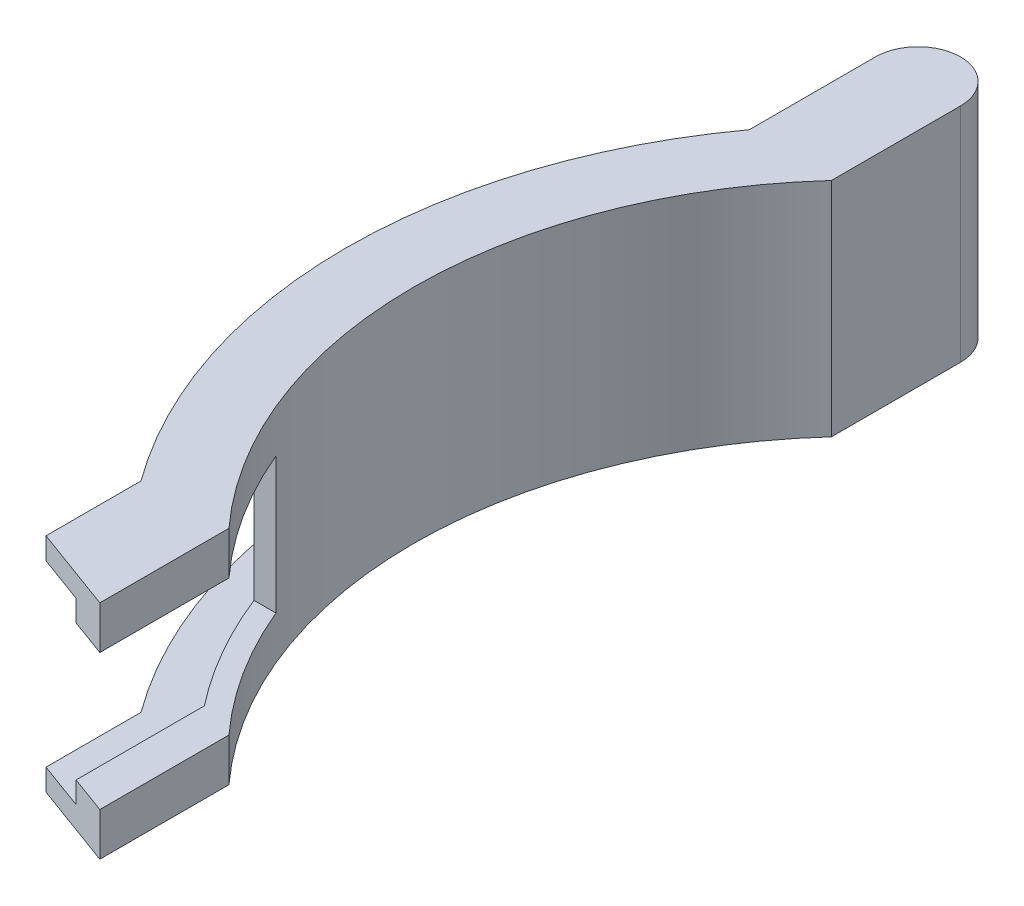
ISO-10303-21;
HEADER;
FILE_DESCRIPTION(('STEP AP214'),'2;1');
FILE_NAME('part.step','',(''),(''),'','','');
FILE_SCHEMA(('AUTOMOTIVE_DESIGN { 1 0 10303 214 1 1 1 1 }'));
ENDSEC;
DATA;
#1=APPLICATION_CONTEXT('core data for automotive mechanical design processes');
#2=APPLICATION_PROTOCOL_DEFINITION('international standard','automotive_design',2000,#1);
#3=PRODUCT_CONTEXT('',#1,'mechanical');
#4=PRODUCT('Part','Part','',(#3));
#5=PRODUCT_RELATED_PRODUCT_CATEGORY('part','',(#4));
#6=PRODUCT_DEFINITION_FORMATION('','',#4);
#7=PRODUCT_DEFINITION_CONTEXT('part definition',#1,'design');
#8=PRODUCT_DEFINITION('design','',#6,#7);
#9=PRODUCT_DEFINITION_SHAPE('','',#8);
#10=(LENGTH_UNIT() NAMED_UNIT(*) SI_UNIT(.MILLI.,.METRE.));
#11=(NAMED_UNIT(*) PLANE_ANGLE_UNIT() SI_UNIT($,.RADIAN.));
#12=(NAMED_UNIT(*) SI_UNIT($,.STERADIAN.) SOLID_ANGLE_UNIT());
#13=UNCERTAINTY_MEASURE_WITH_UNIT(LENGTH_MEASURE(1.E-05),#10,'distance_accuracy_value','');
#14=(GEOMETRIC_REPRESENTATION_CONTEXT(3) GLOBAL_UNCERTAINTY_ASSIGNED_CONTEXT((#13)) GLOBAL_UNIT_ASSIGNED_CONTEXT((#10,
#11,#12)) REPRESENTATION_CONTEXT('',''));
#15=CARTESIAN_POINT('',(0.,0.,0.));
#16=DIRECTION('',(0.,0.,1.));
#17=DIRECTION('',(1.,0.,0.));
#18=AXIS2_PLACEMENT_3D('',#15,#16,#17);
#19=CARTESIAN_POINT('',(45.070883340399,13.208,-19.0499999999988));
#20=DIRECTION('',(0.,1.,0.));
#21=DIRECTION('',(0.,0.,1.));
#22=AXIS2_PLACEMENT_3D('',#19,#20,#21);
#23=PLANE('',#22);
#24=DIRECTION('',(-1.,0.,0.));
#25=VECTOR('',#24,1.);
#26=CARTESIAN_POINT('',(12.971967470857,13.208,-6.35));
#27=LINE('',#26,#25);
#28=CARTESIAN_POINT('',(14.5908833403985,13.208,-6.35));
#29=VERTEX_POINT('',#28);
#30=CARTESIAN_POINT('',(12.971967470857,13.208,-6.35));
#31=VERTEX_POINT('',#30);
#32=EDGE_CURVE('E55',#29,#31,#27,.T.);
#33=ORIENTED_EDGE('',*,*,#32,.F.);
#34=CARTESIAN_POINT('',(45.070883340399,13.208,-19.0499999999988));
#35=DIRECTION('',(0.,1.,0.));
#36=DIRECTION('',(0.,0.,1.));
#37=AXIS2_PLACEMENT_3D('',#34,#35,#36);
#38=CIRCLE('',#37,33.02);
#39=CARTESIAN_POINT('',(20.650199999999,13.208,3.1750000042287));
#40=VERTEX_POINT('',#39);
#41=EDGE_CURVE('E111',#29,#40,#38,.T.);
#42=ORIENTED_EDGE('',*,*,#41,.T.);
#43=DIRECTION('',(0.,0.,1.));
#44=VECTOR('',#43,1.);
#45=CARTESIAN_POINT('',(20.650199999999,13.208,3.1750000042287));
#46=LINE('',#45,#44);
#47=CARTESIAN_POINT('',(20.650199999999,13.208,12.6999999966649));
#48=VERTEX_POINT('',#47);
#49=EDGE_CURVE('E107',#40,#48,#46,.T.);
#50=ORIENTED_EDGE('',*,*,#49,.T.);
#51=DIRECTION('',(-0.93894337416413,0.,-0.344071707807078));
#52=VECTOR('',#51,1.);
#53=CARTESIAN_POINT('',(20.650199999999,13.208,12.6999999966649));
#54=LINE('',#53,#52);
#55=CARTESIAN_POINT('',(17.8802000055981,13.208,11.68494556961));
#56=VERTEX_POINT('',#55);
#57=EDGE_CURVE('E87',#48,#56,#54,.T.);
#58=ORIENTED_EDGE('',*,*,#57,.T.);
#59=DIRECTION('',(0.,0.,-1.));
#60=VECTOR('',#59,1.);
#61=CARTESIAN_POINT('',(17.8802000055981,13.208,11.68494556961));
#62=LINE('',#61,#60);
#63=CARTESIAN_POINT('',(17.8802000055981,13.208,2.21727861731799));
#64=VERTEX_POINT('',#63);
#65=EDGE_CURVE('E100',#56,#64,#62,.T.);
#66=ORIENTED_EDGE('',*,*,#65,.T.);
#67=CARTESIAN_POINT('',(45.070883340399,13.208,-19.0499999999988));
#68=DIRECTION('',(0.,-1.,0.));
#69=DIRECTION('',(0.,0.,-1.));
#70=AXIS2_PLACEMENT_3D('',#67,#68,#69);
#71=CIRCLE('',#70,34.52);
#72=EDGE_CURVE('E104',#64,#31,#71,.T.);
#73=ORIENTED_EDGE('',*,*,#72,.T.);
#74=EDGE_LOOP('',(#33,#42,#50,#58,#66,#73));
#75=FACE_BOUND('',#74,.T.);
#76=ADVANCED_FACE('F39',(#75),#23,.F.);
#77=CARTESIAN_POINT('',(45.070883340399,14.783,-19.0499999999988));
#78=DIRECTION('',(0.,-1.,0.));
#79=DIRECTION('',(0.,0.,-1.));
#80=AXIS2_PLACEMENT_3D('',#77,#78,#79);
#81=CYLINDRICAL_SURFACE('',#80,33.02);
#82=ORIENTED_EDGE('',*,*,#41,.F.);
#83=DIRECTION('',(0.,1.,0.));
#84=VECTOR('',#83,1.);
#85=CARTESIAN_POINT('',(14.5908833399927,3.175,-6.35));
#86=LINE('',#85,#84);
#87=CARTESIAN_POINT('',(14.5908833399927,3.175,-6.35));
#88=VERTEX_POINT('',#87);
#89=EDGE_CURVE('E359',#88,#29,#86,.T.);
#90=ORIENTED_EDGE('',*,*,#89,.F.);
#91=CARTESIAN_POINT('',(45.0708833404013,3.175,-19.0499999999992));
#92=DIRECTION('',(0.,1.,0.));
#93=DIRECTION('',(0.,0.,-1.));
#94=AXIS2_PLACEMENT_3D('',#91,#92,#93);
#95=CIRCLE('',#94,33.02);
#96=CARTESIAN_POINT('',(20.6502000000013,3.175,3.17500000422821));
#97=VERTEX_POINT('',#96);
#98=EDGE_CURVE('E305',#88,#97,#95,.T.);
#99=ORIENTED_EDGE('',*,*,#98,.T.);
#100=DIRECTION('',(0.,1.,0.));
#101=VECTOR('',#100,1.);
#102=CARTESIAN_POINT('',(20.6502000000013,1.6,3.17500000422821));
#103=LINE('',#102,#101);
#104=CARTESIAN_POINT('',(20.6502,0.,3.17500000422744));
#105=VERTEX_POINT('',#104);
#106=EDGE_CURVE('E345',#105,#97,#103,.T.);
#107=ORIENTED_EDGE('',*,*,#106,.F.);
#108=CARTESIAN_POINT('',(45.0708833404,0.,-19.05));
#109=DIRECTION('',(0.,1.,0.));
#110=DIRECTION('',(0.,0.,-1.));
#111=AXIS2_PLACEMENT_3D('',#108,#109,#110);
#112=CIRCLE('',#111,33.02);
#113=CARTESIAN_POINT('',(20.6502,0.,-41.2750000042275));
#114=VERTEX_POINT('',#113);
#115=EDGE_CURVE('E669',#114,#105,#112,.T.);
#116=ORIENTED_EDGE('',*,*,#115,.F.);
#117=DIRECTION('',(0.,-1.,0.));
#118=VECTOR('',#117,1.);
#119=CARTESIAN_POINT('',(20.650199999999,14.783,-41.2750000042262));
#120=LINE('',#119,#118);
#121=CARTESIAN_POINT('',(20.6502,16.383,-41.2750000042275));
#122=VERTEX_POINT('',#121);
#123=EDGE_CURVE('E48',#122,#114,#120,.T.);
#124=ORIENTED_EDGE('',*,*,#123,.F.);
#125=CARTESIAN_POINT('',(45.0708833404,16.383,-19.05));
#126=DIRECTION('',(0.,-1.,0.));
#127=DIRECTION('',(0.,0.,1.));
#128=AXIS2_PLACEMENT_3D('',#125,#126,#127);
#129=CIRCLE('',#128,33.02);
#130=CARTESIAN_POINT('',(20.6502,16.383,3.17500000422744));
#131=VERTEX_POINT('',#130);
#132=EDGE_CURVE('E284',#131,#122,#129,.T.);
#133=ORIENTED_EDGE('',*,*,#132,.F.);
#134=DIRECTION('',(0.,-1.,0.));
#135=VECTOR('',#134,1.);
#136=CARTESIAN_POINT('',(20.650199999999,14.783,3.1750000042287));
#137=LINE('',#136,#135);
#138=EDGE_CURVE('E128',#131,#40,#137,.T.);
#139=ORIENTED_EDGE('',*,*,#138,.T.);
#140=EDGE_LOOP('',(#82,#90,#99,#107,#116,#124,#133,#139));
#141=FACE_BOUND('',#140,.T.);
#142=ADVANCED_FACE('F41',(#141),#81,.F.);
#143=CARTESIAN_POINT('',(20.650199999999,14.783,-41.4910863472114));
#144=DIRECTION('',(1.,0.,0.));
#145=DIRECTION('',(0.,0.,-1.));
#146=AXIS2_PLACEMENT_3D('',#143,#144,#145);
#147=PLANE('',#146);
#148=ORIENTED_EDGE('',*,*,#123,.T.);
#149=DIRECTION('',(0.,0.,1.));
#150=VECTOR('',#149,1.);
#151=CARTESIAN_POINT('',(20.6502,0.,-41.2750000042275));
#152=LINE('',#151,#150);
#153=CARTESIAN_POINT('',(20.6502,0.,-50.8));
#154=VERTEX_POINT('',#153);
#155=EDGE_CURVE('E291',#154,#114,#152,.T.);
#156=ORIENTED_EDGE('',*,*,#155,.F.);
#157=DIRECTION('',(0.,-1.,0.));
#158=VECTOR('',#157,1.);
#159=CARTESIAN_POINT('',(20.6502,1.6,-50.8));
#160=LINE('',#159,#158);
#161=CARTESIAN_POINT('',(20.6502,16.383,-50.8));
#162=VERTEX_POINT('',#161);
#163=EDGE_CURVE('E270',#162,#154,#160,.T.);
#164=ORIENTED_EDGE('',*,*,#163,.F.);
#165=DIRECTION('',(0.,0.,-1.));
#166=VECTOR('',#165,1.);
#167=CARTESIAN_POINT('',(20.6502,16.383,-41.4910863472114));
#168=LINE('',#167,#166);
#169=EDGE_CURVE('E281',#122,#162,#168,.T.);
#170=ORIENTED_EDGE('',*,*,#169,.F.);
#171=EDGE_LOOP('',(#148,#156,#164,#170));
#172=FACE_BOUND('',#171,.T.);
#173=ADVANCED_FACE('F289',(#172),#147,.T.);
#174=CARTESIAN_POINT('',(17.8802000055981,14.783,-40.3172786173155));
#175=DIRECTION('',(-1.,0.,0.));
#176=DIRECTION('',(0.,0.,1.));
#177=AXIS2_PLACEMENT_3D('',#174,#175,#176);
#178=PLANE('',#177);
#179=DIRECTION('',(0.,1.,0.));
#180=VECTOR('',#179,1.);
#181=CARTESIAN_POINT('',(17.8802000055981,-8.86711902815972,-47.6863205077591));
#182=LINE('',#181,#180);
#183=CARTESIAN_POINT('',(17.8802000056,1.6,-47.6863205077593));
#184=VERTEX_POINT('',#183);
#185=CARTESIAN_POINT('',(17.8802000055981,14.783,-47.6863205077591));
#186=VERTEX_POINT('',#185);
#187=EDGE_CURVE('E632',#184,#186,#182,.T.);
#188=ORIENTED_EDGE('',*,*,#187,.F.);
#189=DIRECTION('',(0.,0.,-1.));
#190=VECTOR('',#189,1.);
#191=CARTESIAN_POINT('',(17.8802000056,1.6,-41.4910863472114));
#192=LINE('',#191,#190);
#193=CARTESIAN_POINT('',(17.8802000056,1.6,-40.3172786173155));
#194=VERTEX_POINT('',#193);
#195=EDGE_CURVE('E315',#194,#184,#192,.T.);
#196=ORIENTED_EDGE('',*,*,#195,.F.);
#197=DIRECTION('',(0.,-1.,0.));
#198=VECTOR('',#197,1.);
#199=CARTESIAN_POINT('',(17.8802000055981,14.783,-40.3172786173155));
#200=LINE('',#199,#198);
#201=CARTESIAN_POINT('',(17.8802000055981,14.783,-40.3172786173155));
#202=VERTEX_POINT('',#201);
#203=EDGE_CURVE('E121',#202,#194,#200,.T.);
#204=ORIENTED_EDGE('',*,*,#203,.F.);
#205=DIRECTION('',(0.,0.,-1.));
#206=VECTOR('',#205,1.);
#207=CARTESIAN_POINT('',(17.8802000055981,14.783,-40.3172786173155));
#208=LINE('',#207,#206);
#209=EDGE_CURVE('E131',#202,#186,#208,.T.);
#210=ORIENTED_EDGE('',*,*,#209,.T.);
#211=EDGE_LOOP('',(#188,#196,#204,#210));
#212=FACE_BOUND('',#211,.T.);
#213=ADVANCED_FACE('F418',(#212),#178,.T.);
#214=CARTESIAN_POINT('',(45.070883340399,14.783,-19.0499999999988));
#215=DIRECTION('',(0.,-1.,0.));
#216=DIRECTION('',(0.,0.,-1.));
#217=AXIS2_PLACEMENT_3D('',#214,#215,#216);
#218=CYLINDRICAL_SURFACE('',#217,34.52);
#219=ORIENTED_EDGE('',*,*,#72,.F.);
#220=DIRECTION('',(0.,-1.,0.));
#221=VECTOR('',#220,1.);
#222=CARTESIAN_POINT('',(17.8802000055981,14.783,2.21727861731799));
#223=LINE('',#222,#221);
#224=CARTESIAN_POINT('',(17.8802000055981,14.783,2.21727861731799));
#225=VERTEX_POINT('',#224);
#226=EDGE_CURVE('E96',#225,#64,#223,.T.);
#227=ORIENTED_EDGE('',*,*,#226,.F.);
#228=CARTESIAN_POINT('',(45.070883340399,14.783,-19.0499999999988));
#229=DIRECTION('',(0.,-1.,0.));
#230=DIRECTION('',(0.,0.,-1.));
#231=AXIS2_PLACEMENT_3D('',#228,#229,#230);
#232=CIRCLE('',#231,34.52);
#233=EDGE_CURVE('E64',#225,#202,#232,.T.);
#234=ORIENTED_EDGE('',*,*,#233,.T.);
#235=ORIENTED_EDGE('',*,*,#203,.T.);
#236=CARTESIAN_POINT('',(45.0708833404013,1.6,-19.0499999999992));
#237=DIRECTION('',(0.,-1.,0.));
#238=DIRECTION('',(0.,0.,1.));
#239=AXIS2_PLACEMENT_3D('',#236,#237,#238);
#240=CIRCLE('',#239,34.5200000000003);
#241=CARTESIAN_POINT('',(17.8802000055995,1.6,2.21727861731686));
#242=VERTEX_POINT('',#241);
#243=EDGE_CURVE('E310',#242,#194,#240,.T.);
#244=ORIENTED_EDGE('',*,*,#243,.F.);
#245=DIRECTION('',(0.,1.,0.));
#246=VECTOR('',#245,1.);
#247=CARTESIAN_POINT('',(17.8802000055995,1.6,2.21727861731686));
#248=LINE('',#247,#246);
#249=CARTESIAN_POINT('',(17.8802000055995,3.175,2.21727861731686));
#250=VERTEX_POINT('',#249);
#251=EDGE_CURVE('E319',#242,#250,#248,.T.);
#252=ORIENTED_EDGE('',*,*,#251,.T.);
#253=CARTESIAN_POINT('',(45.0708833404013,3.175,-19.0499999999992));
#254=DIRECTION('',(0.,-1.,0.));
#255=DIRECTION('',(0.,0.,1.));
#256=AXIS2_PLACEMENT_3D('',#253,#254,#255);
#257=CIRCLE('',#256,34.5200000000003);
#258=CARTESIAN_POINT('',(12.9719674708577,3.175,-6.35));
#259=VERTEX_POINT('',#258);
#260=EDGE_CURVE('E311',#250,#259,#257,.T.);
#261=ORIENTED_EDGE('',*,*,#260,.T.);
#262=DIRECTION('',(0.,1.,0.));
#263=VECTOR('',#262,1.);
#264=CARTESIAN_POINT('',(12.971967470857,3.175,-6.35));
#265=LINE('',#264,#263);
#266=EDGE_CURVE('E353',#259,#31,#265,.T.);
#267=ORIENTED_EDGE('',*,*,#266,.T.);
#268=EDGE_LOOP('',(#219,#227,#234,#235,#244,#252,#261,#267));
#269=FACE_BOUND('',#268,.T.);
#270=ADVANCED_FACE('F421',(#269),#218,.T.);
#271=CARTESIAN_POINT('',(17.8802000055981,14.783,11.68494556961));
#272=DIRECTION('',(-1.,0.,0.));
#273=DIRECTION('',(0.,0.,1.));
#274=AXIS2_PLACEMENT_3D('',#271,#272,#273);
#275=PLANE('',#274);
#276=ORIENTED_EDGE('',*,*,#65,.F.);
#277=DIRECTION('',(0.,-1.,0.));
#278=VECTOR('',#277,1.);
#279=CARTESIAN_POINT('',(17.8802000055981,14.783,11.68494556961));
#280=LINE('',#279,#278);
#281=CARTESIAN_POINT('',(17.8802000055981,14.783,11.6849455696082));
#282=VERTEX_POINT('',#281);
#283=EDGE_CURVE('E82',#282,#56,#280,.T.);
#284=ORIENTED_EDGE('',*,*,#283,.F.);
#285=DIRECTION('',(0.,0.,-1.));
#286=VECTOR('',#285,1.);
#287=CARTESIAN_POINT('',(17.8802000055981,14.783,11.68494556961));
#288=LINE('',#287,#286);
#289=EDGE_CURVE('E117',#282,#225,#288,.T.);
#290=ORIENTED_EDGE('',*,*,#289,.T.);
#291=ORIENTED_EDGE('',*,*,#226,.T.);
#292=EDGE_LOOP('',(#276,#284,#290,#291));
#293=FACE_BOUND('',#292,.T.);
#294=ADVANCED_FACE('F101',(#293),#275,.T.);
#295=CARTESIAN_POINT('',(20.650199999999,14.783,12.6999999966649));
#296=DIRECTION('',(-0.344071707807078,0.,0.93894337416413));
#297=DIRECTION('',(0.93894337416413,0.,0.344071707807078));
#298=AXIS2_PLACEMENT_3D('',#295,#296,#297);
#299=PLANE('',#298);
#300=ORIENTED_EDGE('',*,*,#57,.F.);
#301=DIRECTION('',(0.,-1.,0.));
#302=VECTOR('',#301,1.);
#303=CARTESIAN_POINT('',(20.650199999999,14.783,12.6999999966649));
#304=LINE('',#303,#302);
#305=CARTESIAN_POINT('',(20.6502,16.383,12.6999999966636));
#306=VERTEX_POINT('',#305);
#307=EDGE_CURVE('E97',#306,#48,#304,.T.);
#308=ORIENTED_EDGE('',*,*,#307,.F.);
#309=DIRECTION('',(0.938943374164107,0.,0.344071707807139));
#310=VECTOR('',#309,1.);
#311=CARTESIAN_POINT('',(20.6502,16.383,12.6999999966636));
#312=LINE('',#311,#310);
#313=CARTESIAN_POINT('',(14.3802000056,16.383,10.40238582164));
#314=VERTEX_POINT('',#313);
#315=EDGE_CURVE('E371',#314,#306,#312,.T.);
#316=ORIENTED_EDGE('',*,*,#315,.F.);
#317=DIRECTION('',(0.,-1.,0.));
#318=VECTOR('',#317,1.);
#319=CARTESIAN_POINT('',(14.3802000056,16.383,10.40238582164));
#320=LINE('',#319,#318);
#321=CARTESIAN_POINT('',(14.3802000056,14.783,10.40238582164));
#322=VERTEX_POINT('',#321);
#323=EDGE_CURVE('E149',#314,#322,#320,.T.);
#324=ORIENTED_EDGE('',*,*,#323,.T.);
#325=DIRECTION('',(0.938943374164107,0.,0.344071707807139));
#326=VECTOR('',#325,1.);
#327=CARTESIAN_POINT('',(20.6502,14.783,12.6999999966636));
#328=LINE('',#327,#326);
#329=EDGE_CURVE('E92',#322,#282,#328,.T.);
#330=ORIENTED_EDGE('',*,*,#329,.T.);
#331=ORIENTED_EDGE('',*,*,#283,.T.);
#332=EDGE_LOOP('',(#300,#308,#316,#324,#330,#331));
#333=FACE_BOUND('',#332,.T.);
#334=ADVANCED_FACE('F84',(#333),#299,.T.);
#335=CARTESIAN_POINT('',(20.650199999999,14.783,3.1750000042287));
#336=DIRECTION('',(1.,0.,0.));
#337=DIRECTION('',(0.,0.,-1.));
#338=AXIS2_PLACEMENT_3D('',#335,#336,#337);
#339=PLANE('',#338);
#340=ORIENTED_EDGE('',*,*,#49,.F.);
#341=ORIENTED_EDGE('',*,*,#138,.F.);
#342=DIRECTION('',(0.,0.,-1.));
#343=VECTOR('',#342,1.);
#344=CARTESIAN_POINT('',(20.6502,16.383,3.17500000422744));
#345=LINE('',#344,#343);
#346=EDGE_CURVE('E375',#306,#131,#345,.T.);
#347=ORIENTED_EDGE('',*,*,#346,.F.);
#348=ORIENTED_EDGE('',*,*,#307,.T.);
#349=EDGE_LOOP('',(#340,#341,#347,#348));
#350=FACE_BOUND('',#349,.T.);
#351=ADVANCED_FACE('F400',(#350),#339,.T.);
#352=CARTESIAN_POINT('',(45.0708833404,14.783,-19.05));
#353=DIRECTION('',(0.,-1.,0.));
#354=DIRECTION('',(0.,0.,-1.));
#355=AXIS2_PLACEMENT_3D('',#352,#353,#354);
#356=PLANE('',#355);
#357=CARTESIAN_POINT('',(17.5152000028,14.783,-50.8));
#358=DIRECTION('',(0.,-1.,0.));
#359=DIRECTION('',(0.,0.,-1.));
#360=AXIS2_PLACEMENT_3D('',#357,#358,#359);
#361=CIRCLE('',#360,3.1349999972);
#362=CARTESIAN_POINT('',(14.3802000056,14.783,-50.8));
#363=VERTEX_POINT('',#362);
#364=EDGE_CURVE('E654',#186,#363,#361,.T.);
#365=ORIENTED_EDGE('',*,*,#364,.F.);
#366=ORIENTED_EDGE('',*,*,#209,.F.);
#367=ORIENTED_EDGE('',*,*,#233,.F.);
#368=ORIENTED_EDGE('',*,*,#289,.F.);
#369=ORIENTED_EDGE('',*,*,#329,.F.);
#370=DIRECTION('',(0.,0.,1.));
#371=VECTOR('',#370,1.);
#372=CARTESIAN_POINT('',(14.3802000056,14.783,10.40238582164));
#373=LINE('',#372,#371);
#374=CARTESIAN_POINT('',(14.3802000056,14.783,3.39108634721005));
#375=VERTEX_POINT('',#374);
#376=EDGE_CURVE('E382',#375,#322,#373,.T.);
#377=ORIENTED_EDGE('',*,*,#376,.F.);
#378=CARTESIAN_POINT('',(45.0708833404,14.783,-19.05));
#379=DIRECTION('',(0.,1.,0.));
#380=DIRECTION('',(0.,0.,-1.));
#381=AXIS2_PLACEMENT_3D('',#378,#379,#380);
#382=CIRCLE('',#381,38.0199999999992);
#383=CARTESIAN_POINT('',(14.3802000056,14.783,-41.4910863472114));
#384=VERTEX_POINT('',#383);
#385=EDGE_CURVE('E363',#384,#375,#382,.T.);
#386=ORIENTED_EDGE('',*,*,#385,.F.);
#387=DIRECTION('',(0.,0.,1.));
#388=VECTOR('',#387,1.);
#389=CARTESIAN_POINT('',(14.3802000056,14.783,-50.8));
#390=LINE('',#389,#388);
#391=EDGE_CURVE('E297',#363,#384,#390,.T.);
#392=ORIENTED_EDGE('',*,*,#391,.F.);
#393=EDGE_LOOP('',(#365,#366,#367,#368,#369,#377,#386,#392));
#394=FACE_BOUND('',#393,.T.);
#395=ADVANCED_FACE('F163',(#394),#356,.T.);
#396=CARTESIAN_POINT('',(45.0708833404,16.383,-19.05));
#397=DIRECTION('',(0.,-1.,0.));
#398=DIRECTION('',(0.,0.,-1.));
#399=AXIS2_PLACEMENT_3D('',#396,#397,#398);
#400=CYLINDRICAL_SURFACE('',#399,38.0199999999992);
#401=ORIENTED_EDGE('',*,*,#385,.T.);
#402=DIRECTION('',(0.,-1.,0.));
#403=VECTOR('',#402,1.);
#404=CARTESIAN_POINT('',(14.3802000056,16.383,3.39108634721005));
#405=LINE('',#404,#403);
#406=CARTESIAN_POINT('',(14.3802000056,16.383,3.39108634721005));
#407=VERTEX_POINT('',#406);
#408=EDGE_CURVE('E146',#407,#375,#405,.T.);
#409=ORIENTED_EDGE('',*,*,#408,.F.);
#410=CARTESIAN_POINT('',(45.0708833404,16.383,-19.05));
#411=DIRECTION('',(0.,1.,0.));
#412=DIRECTION('',(0.,0.,-1.));
#413=AXIS2_PLACEMENT_3D('',#410,#411,#412);
#414=CIRCLE('',#413,38.0199999999992);
#415=CARTESIAN_POINT('',(14.3802000056,16.383,-41.4910863472114));
#416=VERTEX_POINT('',#415);
#417=EDGE_CURVE('E364',#416,#407,#414,.T.);
#418=ORIENTED_EDGE('',*,*,#417,.F.);
#419=DIRECTION('',(0.,-1.,0.));
#420=VECTOR('',#419,1.);
#421=CARTESIAN_POINT('',(14.3802000056,16.383,-41.4910863472114));
#422=LINE('',#421,#420);
#423=EDGE_CURVE('E158',#416,#384,#422,.T.);
#424=ORIENTED_EDGE('',*,*,#423,.T.);
#425=EDGE_LOOP('',(#401,#409,#418,#424));
#426=FACE_BOUND('',#425,.T.);
#427=ADVANCED_FACE('F392',(#426),#400,.T.);
#428=CARTESIAN_POINT('',(14.3802000056,16.383,10.40238582164));
#429=DIRECTION('',(1.,0.,0.));
#430=DIRECTION('',(0.,0.,-1.));
#431=AXIS2_PLACEMENT_3D('',#428,#429,#430);
#432=PLANE('',#431);
#433=ORIENTED_EDGE('',*,*,#376,.T.);
#434=ORIENTED_EDGE('',*,*,#323,.F.);
#435=DIRECTION('',(0.,0.,1.));
#436=VECTOR('',#435,1.);
#437=CARTESIAN_POINT('',(14.3802000056,16.383,10.40238582164));
#438=LINE('',#437,#436);
#439=EDGE_CURVE('E368',#407,#314,#438,.T.);
#440=ORIENTED_EDGE('',*,*,#439,.F.);
#441=ORIENTED_EDGE('',*,*,#408,.T.);
#442=EDGE_LOOP('',(#433,#434,#440,#441));
#443=FACE_BOUND('',#442,.T.);
#444=ADVANCED_FACE('F396',(#443),#432,.F.);
#445=CARTESIAN_POINT('',(45.0708833404,16.383,-19.05));
#446=DIRECTION('',(0.,-1.,0.));
#447=DIRECTION('',(0.,0.,-1.));
#448=AXIS2_PLACEMENT_3D('',#445,#446,#447);
#449=PLANE('',#448);
#450=ORIENTED_EDGE('',*,*,#169,.T.);
#451=CARTESIAN_POINT('',(17.5152000028,16.383,-50.8));
#452=DIRECTION('',(0.,1.,0.));
#453=DIRECTION('',(0.,0.,1.));
#454=AXIS2_PLACEMENT_3D('',#451,#452,#453);
#455=CIRCLE('',#454,3.1349999972);
#456=CARTESIAN_POINT('',(14.3802000056,16.383,-50.8));
#457=VERTEX_POINT('',#456);
#458=EDGE_CURVE('E266',#162,#457,#455,.T.);
#459=ORIENTED_EDGE('',*,*,#458,.T.);
#460=DIRECTION('',(0.,0.,1.));
#461=VECTOR('',#460,1.);
#462=CARTESIAN_POINT('',(14.3802000056,16.383,-50.8));
#463=LINE('',#462,#461);
#464=EDGE_CURVE('E293',#457,#416,#463,.T.);
#465=ORIENTED_EDGE('',*,*,#464,.T.);
#466=ORIENTED_EDGE('',*,*,#417,.T.);
#467=ORIENTED_EDGE('',*,*,#439,.T.);
#468=ORIENTED_EDGE('',*,*,#315,.T.);
#469=ORIENTED_EDGE('',*,*,#346,.T.);
#470=ORIENTED_EDGE('',*,*,#132,.T.);
#471=EDGE_LOOP('',(#450,#459,#465,#466,#467,#468,#469,#470));
#472=FACE_BOUND('',#471,.T.);
#473=ADVANCED_FACE('F282',(#472),#449,.F.);
#474=CARTESIAN_POINT('',(12.971967470857,3.175,-6.35));
#475=DIRECTION('',(0.,0.,-1.));
#476=DIRECTION('',(-1.,0.,0.));
#477=AXIS2_PLACEMENT_3D('',#474,#475,#476);
#478=PLANE('',#477);
#479=ORIENTED_EDGE('',*,*,#32,.T.);
#480=ORIENTED_EDGE('',*,*,#266,.F.);
#481=DIRECTION('',(-1.,0.,0.));
#482=VECTOR('',#481,1.);
#483=CARTESIAN_POINT('',(12.971967470857,3.175,-6.35));
#484=LINE('',#483,#482);
#485=EDGE_CURVE('E349',#88,#259,#484,.T.);
#486=ORIENTED_EDGE('',*,*,#485,.F.);
#487=ORIENTED_EDGE('',*,*,#89,.T.);
#488=EDGE_LOOP('',(#479,#480,#486,#487));
#489=FACE_BOUND('',#488,.T.);
#490=ADVANCED_FACE('F463',(#489),#478,.F.);
#491=CARTESIAN_POINT('',(20.6502000000013,1.6,12.6999999966644));
#492=DIRECTION('',(-1.,0.,0.));
#493=DIRECTION('',(0.,0.,1.));
#494=AXIS2_PLACEMENT_3D('',#491,#492,#493);
#495=PLANE('',#494);
#496=DIRECTION('',(0.,0.,1.));
#497=VECTOR('',#496,1.);
#498=CARTESIAN_POINT('',(20.6502000000013,3.175,12.6999999966644));
#499=LINE('',#498,#497);
#500=CARTESIAN_POINT('',(20.6502000000013,3.175,12.6999999966644));
#501=VERTEX_POINT('',#500);
#502=EDGE_CURVE('E322',#97,#501,#499,.T.);
#503=ORIENTED_EDGE('',*,*,#502,.T.);
#504=DIRECTION('',(0.,1.,0.));
#505=VECTOR('',#504,1.);
#506=CARTESIAN_POINT('',(20.6502000000013,1.6,12.6999999966644));
#507=LINE('',#506,#505);
#508=CARTESIAN_POINT('',(20.6502,0.,12.6999999966636));
#509=VERTEX_POINT('',#508);
#510=EDGE_CURVE('E341',#509,#501,#507,.T.);
#511=ORIENTED_EDGE('',*,*,#510,.F.);
#512=DIRECTION('',(0.,0.,1.));
#513=VECTOR('',#512,1.);
#514=CARTESIAN_POINT('',(20.6502,0.,12.6999999966636));
#515=LINE('',#514,#513);
#516=EDGE_CURVE('E639',#105,#509,#515,.T.);
#517=ORIENTED_EDGE('',*,*,#516,.F.);
#518=ORIENTED_EDGE('',*,*,#106,.T.);
#519=EDGE_LOOP('',(#503,#511,#517,#518));
#520=FACE_BOUND('',#519,.T.);
#521=ADVANCED_FACE('F468',(#520),#495,.F.);
#522=CARTESIAN_POINT('',(17.8802000056,1.6,11.6849455696083));
#523=DIRECTION('',(0.344071707807416,0.,-0.938943374164006));
#524=DIRECTION('',(-0.938943374164006,0.,-0.344071707807416));
#525=AXIS2_PLACEMENT_3D('',#522,#523,#524);
#526=PLANE('',#525);
#527=DIRECTION('',(-0.938943374164006,0.,-0.344071707807416));
#528=VECTOR('',#527,1.);
#529=CARTESIAN_POINT('',(17.8802000056,3.175,11.6849455696083));
#530=LINE('',#529,#528);
#531=CARTESIAN_POINT('',(17.8802000056,3.175,11.6849455696083));
#532=VERTEX_POINT('',#531);
#533=EDGE_CURVE('E325',#501,#532,#530,.T.);
#534=ORIENTED_EDGE('',*,*,#533,.T.);
#535=DIRECTION('',(0.,1.,0.));
#536=VECTOR('',#535,1.);
#537=CARTESIAN_POINT('',(17.8802000056,1.6,11.6849455696083));
#538=LINE('',#537,#536);
#539=CARTESIAN_POINT('',(17.8802000056,1.6,11.6849455696083));
#540=VERTEX_POINT('',#539);
#541=EDGE_CURVE('E337',#540,#532,#538,.T.);
#542=ORIENTED_EDGE('',*,*,#541,.F.);
#543=DIRECTION('',(-0.938943374164107,0.,-0.344071707807139));
#544=VECTOR('',#543,1.);
#545=CARTESIAN_POINT('',(14.3802000056,1.6,10.40238582164));
#546=LINE('',#545,#544);
#547=CARTESIAN_POINT('',(14.3802000056,1.6,10.40238582164));
#548=VERTEX_POINT('',#547);
#549=EDGE_CURVE('E648',#540,#548,#546,.T.);
#550=ORIENTED_EDGE('',*,*,#549,.T.);
#551=DIRECTION('',(0.,1.,0.));
#552=VECTOR('',#551,1.);
#553=CARTESIAN_POINT('',(14.3802000056,0.,10.40238582164));
#554=LINE('',#553,#552);
#555=CARTESIAN_POINT('',(14.3802000056,0.,10.40238582164));
#556=VERTEX_POINT('',#555);
#557=EDGE_CURVE('E299',#556,#548,#554,.T.);
#558=ORIENTED_EDGE('',*,*,#557,.F.);
#559=DIRECTION('',(-0.938943374164107,0.,-0.344071707807139));
#560=VECTOR('',#559,1.);
#561=CARTESIAN_POINT('',(14.3802000056,0.,10.40238582164));
#562=LINE('',#561,#560);
#563=EDGE_CURVE('E684',#509,#556,#562,.T.);
#564=ORIENTED_EDGE('',*,*,#563,.F.);
#565=ORIENTED_EDGE('',*,*,#510,.T.);
#566=EDGE_LOOP('',(#534,#542,#550,#558,#564,#565));
#567=FACE_BOUND('',#566,.T.);
#568=ADVANCED_FACE('F515',(#567),#526,.F.);
#569=CARTESIAN_POINT('',(17.8802000055993,1.6,2.21727861731704));
#570=DIRECTION('',(1.,0.,0.));
#571=DIRECTION('',(0.,0.,-1.));
#572=AXIS2_PLACEMENT_3D('',#569,#570,#571);
#573=PLANE('',#572);
#574=DIRECTION('',(0.,0.,-1.));
#575=VECTOR('',#574,1.);
#576=CARTESIAN_POINT('',(17.8802000055993,3.175,2.21727861731704));
#577=LINE('',#576,#575);
#578=EDGE_CURVE('E328',#532,#250,#577,.T.);
#579=ORIENTED_EDGE('',*,*,#578,.T.);
#580=ORIENTED_EDGE('',*,*,#251,.F.);
#581=DIRECTION('',(0.,0.,-1.));
#582=VECTOR('',#581,1.);
#583=CARTESIAN_POINT('',(17.8802000055993,1.6,2.21727861731704));
#584=LINE('',#583,#582);
#585=EDGE_CURVE('E306',#540,#242,#584,.T.);
#586=ORIENTED_EDGE('',*,*,#585,.F.);
#587=ORIENTED_EDGE('',*,*,#541,.T.);
#588=EDGE_LOOP('',(#579,#580,#586,#587));
#589=FACE_BOUND('',#588,.T.);
#590=ADVANCED_FACE('F483',(#589),#573,.F.);
#591=CARTESIAN_POINT('',(45.0708833404013,3.175,-19.0499999999992));
#592=DIRECTION('',(0.,1.,0.));
#593=DIRECTION('',(0.,0.,1.));
#594=AXIS2_PLACEMENT_3D('',#591,#592,#593);
#595=PLANE('',#594);
#596=ORIENTED_EDGE('',*,*,#98,.F.);
#597=ORIENTED_EDGE('',*,*,#485,.T.);
#598=ORIENTED_EDGE('',*,*,#260,.F.);
#599=ORIENTED_EDGE('',*,*,#578,.F.);
#600=ORIENTED_EDGE('',*,*,#533,.F.);
#601=ORIENTED_EDGE('',*,*,#502,.F.);
#602=EDGE_LOOP('',(#596,#597,#598,#599,#600,#601));
#603=FACE_BOUND('',#602,.T.);
#604=ADVANCED_FACE('F477',(#603),#595,.T.);
#605=CARTESIAN_POINT('',(14.3802000056,16.383,-50.8));
#606=DIRECTION('',(1.,0.,0.));
#607=DIRECTION('',(0.,0.,-1.));
#608=AXIS2_PLACEMENT_3D('',#605,#606,#607);
#609=PLANE('',#608);
#610=ORIENTED_EDGE('',*,*,#423,.F.);
#611=ORIENTED_EDGE('',*,*,#464,.F.);
#612=DIRECTION('',(0.,1.,0.));
#613=VECTOR('',#612,1.);
#614=CARTESIAN_POINT('',(14.3802000056,16.383,-50.8));
#615=LINE('',#614,#613);
#616=EDGE_CURVE('E273',#363,#457,#615,.T.);
#617=ORIENTED_EDGE('',*,*,#616,.F.);
#618=ORIENTED_EDGE('',*,*,#391,.T.);
#619=EDGE_LOOP('',(#610,#611,#617,#618));
#620=FACE_BOUND('',#619,.T.);
#621=ADVANCED_FACE('F482',(#620),#609,.F.);
#622=CARTESIAN_POINT('',(14.3802000056,0.,3.39108634721078));
#623=DIRECTION('',(1.,0.,0.));
#624=DIRECTION('',(0.,0.,-1.));
#625=AXIS2_PLACEMENT_3D('',#622,#623,#624);
#626=PLANE('',#625);
#627=DIRECTION('',(0.,0.,-1.));
#628=VECTOR('',#627,1.);
#629=CARTESIAN_POINT('',(14.3802000056,1.6,3.39108634721078));
#630=LINE('',#629,#628);
#631=CARTESIAN_POINT('',(14.3802000056,1.6,3.39108634721078));
#632=VERTEX_POINT('',#631);
#633=EDGE_CURVE('E650',#548,#632,#630,.T.);
#634=ORIENTED_EDGE('',*,*,#633,.T.);
#635=DIRECTION('',(0.,1.,0.));
#636=VECTOR('',#635,1.);
#637=CARTESIAN_POINT('',(14.3802000056,0.,3.39108634721078));
#638=LINE('',#637,#636);
#639=CARTESIAN_POINT('',(14.3802000056,0.,3.39108634721078));
#640=VERTEX_POINT('',#639);
#641=EDGE_CURVE('E677',#640,#632,#638,.T.);
#642=ORIENTED_EDGE('',*,*,#641,.F.);
#643=DIRECTION('',(0.,0.,-1.));
#644=VECTOR('',#643,1.);
#645=CARTESIAN_POINT('',(14.3802000056,0.,3.39108634721078));
#646=LINE('',#645,#644);
#647=EDGE_CURVE('E683',#556,#640,#646,.T.);
#648=ORIENTED_EDGE('',*,*,#647,.F.);
#649=ORIENTED_EDGE('',*,*,#557,.T.);
#650=EDGE_LOOP('',(#634,#642,#648,#649));
#651=FACE_BOUND('',#650,.T.);
#652=ADVANCED_FACE('F539',(#651),#626,.F.);
#653=CARTESIAN_POINT('',(45.0708833404,0.,-19.05));
#654=DIRECTION('',(0.,1.,0.));
#655=DIRECTION('',(0.,0.,1.));
#656=AXIS2_PLACEMENT_3D('',#653,#654,#655);
#657=CYLINDRICAL_SURFACE('',#656,38.0199999999996);
#658=CARTESIAN_POINT('',(45.0708833404,1.6,-19.05));
#659=DIRECTION('',(0.,-1.,0.));
#660=DIRECTION('',(0.,0.,1.));
#661=AXIS2_PLACEMENT_3D('',#658,#659,#660);
#662=CIRCLE('',#661,38.0199999999996);
#663=CARTESIAN_POINT('',(14.3802000055998,1.6,-41.4910863472112));
#664=VERTEX_POINT('',#663);
#665=EDGE_CURVE('E658',#632,#664,#662,.T.);
#666=ORIENTED_EDGE('',*,*,#665,.T.);
#667=DIRECTION('',(0.,1.,0.));
#668=VECTOR('',#667,1.);
#669=CARTESIAN_POINT('',(14.3802000055998,0.,-41.4910863472112));
#670=LINE('',#669,#668);
#671=CARTESIAN_POINT('',(14.3802000055998,0.,-41.4910863472112));
#672=VERTEX_POINT('',#671);
#673=EDGE_CURVE('E673',#672,#664,#670,.T.);
#674=ORIENTED_EDGE('',*,*,#673,.F.);
#675=CARTESIAN_POINT('',(45.0708833404,0.,-19.05));
#676=DIRECTION('',(0.,-1.,0.));
#677=DIRECTION('',(0.,0.,1.));
#678=AXIS2_PLACEMENT_3D('',#675,#676,#677);
#679=CIRCLE('',#678,38.0199999999996);
#680=EDGE_CURVE('E689',#640,#672,#679,.T.);
#681=ORIENTED_EDGE('',*,*,#680,.F.);
#682=ORIENTED_EDGE('',*,*,#641,.T.);
#683=EDGE_LOOP('',(#666,#674,#681,#682));
#684=FACE_BOUND('',#683,.T.);
#685=ADVANCED_FACE('F543',(#684),#657,.T.);
#686=CARTESIAN_POINT('',(14.3802000056,0.,-50.8));
#687=DIRECTION('',(1.,0.,0.));
#688=DIRECTION('',(0.,0.,-1.));
#689=AXIS2_PLACEMENT_3D('',#686,#687,#688);
#690=PLANE('',#689);
#691=DIRECTION('',(0.,0.,-1.));
#692=VECTOR('',#691,1.);
#693=CARTESIAN_POINT('',(14.3802000056,1.6,-50.8));
#694=LINE('',#693,#692);
#695=CARTESIAN_POINT('',(14.3802000056,1.6,-50.8));
#696=VERTEX_POINT('',#695);
#697=EDGE_CURVE('E666',#664,#696,#694,.T.);
#698=ORIENTED_EDGE('',*,*,#697,.T.);
#699=DIRECTION('',(0.,1.,0.));
#700=VECTOR('',#699,1.);
#701=CARTESIAN_POINT('',(14.3802000056,0.,-50.8));
#702=LINE('',#701,#700);
#703=CARTESIAN_POINT('',(14.3802000056,0.,-50.8));
#704=VERTEX_POINT('',#703);
#705=EDGE_CURVE('E670',#704,#696,#702,.T.);
#706=ORIENTED_EDGE('',*,*,#705,.F.);
#707=DIRECTION('',(0.,0.,-1.));
#708=VECTOR('',#707,1.);
#709=CARTESIAN_POINT('',(14.3802000056,0.,-50.8));
#710=LINE('',#709,#708);
#711=EDGE_CURVE('E695',#672,#704,#710,.T.);
#712=ORIENTED_EDGE('',*,*,#711,.F.);
#713=ORIENTED_EDGE('',*,*,#673,.T.);
#714=EDGE_LOOP('',(#698,#706,#712,#713));
#715=FACE_BOUND('',#714,.T.);
#716=ADVANCED_FACE('F553',(#715),#690,.F.);
#717=CARTESIAN_POINT('',(45.0708833404,0.,-19.05));
#718=DIRECTION('',(0.,-1.,0.));
#719=DIRECTION('',(0.,0.,-1.));
#720=AXIS2_PLACEMENT_3D('',#717,#718,#719);
#721=PLANE('',#720);
#722=ORIENTED_EDGE('',*,*,#711,.T.);
#723=CARTESIAN_POINT('',(17.5152000028,0.,-50.8));
#724=DIRECTION('',(0.,-1.,0.));
#725=DIRECTION('',(0.,0.,-1.));
#726=AXIS2_PLACEMENT_3D('',#723,#724,#725);
#727=CIRCLE('',#726,3.1349999972);
#728=EDGE_CURVE('E277',#154,#704,#727,.F.);
#729=ORIENTED_EDGE('',*,*,#728,.F.);
#730=ORIENTED_EDGE('',*,*,#155,.T.);
#731=ORIENTED_EDGE('',*,*,#115,.T.);
#732=ORIENTED_EDGE('',*,*,#516,.T.);
#733=ORIENTED_EDGE('',*,*,#563,.T.);
#734=ORIENTED_EDGE('',*,*,#647,.T.);
#735=ORIENTED_EDGE('',*,*,#680,.T.);
#736=EDGE_LOOP('',(#722,#729,#730,#731,#732,#733,#734,#735));
#737=FACE_BOUND('',#736,.T.);
#738=ADVANCED_FACE('F596',(#737),#721,.T.);
#739=CARTESIAN_POINT('',(45.0708833404,1.6,-19.05));
#740=DIRECTION('',(0.,-1.,0.));
#741=DIRECTION('',(0.,0.,-1.));
#742=AXIS2_PLACEMENT_3D('',#739,#740,#741);
#743=PLANE('',#742);
#744=ORIENTED_EDGE('',*,*,#195,.T.);
#745=CARTESIAN_POINT('',(17.5152000028,1.6,-50.8));
#746=DIRECTION('',(0.,-1.,0.));
#747=DIRECTION('',(0.,0.,-1.));
#748=AXIS2_PLACEMENT_3D('',#745,#746,#747);
#749=CIRCLE('',#748,3.1349999972);
#750=EDGE_CURVE('E11',#184,#696,#749,.T.);
#751=ORIENTED_EDGE('',*,*,#750,.T.);
#752=ORIENTED_EDGE('',*,*,#697,.F.);
#753=ORIENTED_EDGE('',*,*,#665,.F.);
#754=ORIENTED_EDGE('',*,*,#633,.F.);
#755=ORIENTED_EDGE('',*,*,#549,.F.);
#756=ORIENTED_EDGE('',*,*,#585,.T.);
#757=ORIENTED_EDGE('',*,*,#243,.T.);
#758=EDGE_LOOP('',(#744,#751,#752,#753,#754,#755,#756,#757));
#759=FACE_BOUND('',#758,.T.);
#760=ADVANCED_FACE('F606',(#759),#743,.F.);
#761=CARTESIAN_POINT('',(17.5152000028,-8.86711902815972,-50.8));
#762=DIRECTION('',(0.,1.,0.));
#763=DIRECTION('',(0.,0.,1.));
#764=AXIS2_PLACEMENT_3D('',#761,#762,#763);
#765=CYLINDRICAL_SURFACE('',#764,3.1349999972);
#766=ORIENTED_EDGE('',*,*,#163,.T.);
#767=ORIENTED_EDGE('',*,*,#728,.T.);
#768=ORIENTED_EDGE('',*,*,#705,.T.);
#769=ORIENTED_EDGE('',*,*,#750,.F.);
#770=ORIENTED_EDGE('',*,*,#187,.T.);
#771=ORIENTED_EDGE('',*,*,#364,.T.);
#772=ORIENTED_EDGE('',*,*,#616,.T.);
#773=ORIENTED_EDGE('',*,*,#458,.F.);
#774=EDGE_LOOP('',(#766,#767,#768,#769,#770,#771,#772,#773));
#775=FACE_BOUND('',#774,.T.);
#776=ADVANCED_FACE('F268',(#775),#765,.T.);
#777=CLOSED_SHELL('',(#76,#142,#173,#213,#270,#294,#334,#351,#395,#427,#444,#473,#490,#521,#568,
#590,#604,#621,#652,#685,#716,#738,#760,#776));
#778=MANIFOLD_SOLID_BREP('B2',#777);
#779=ADVANCED_BREP_SHAPE_REPRESENTATION('',(#18,#778),#14);
#780=SHAPE_DEFINITION_REPRESENTATION(#9,#779);
ENDSEC;
END-ISO-10303-21;
